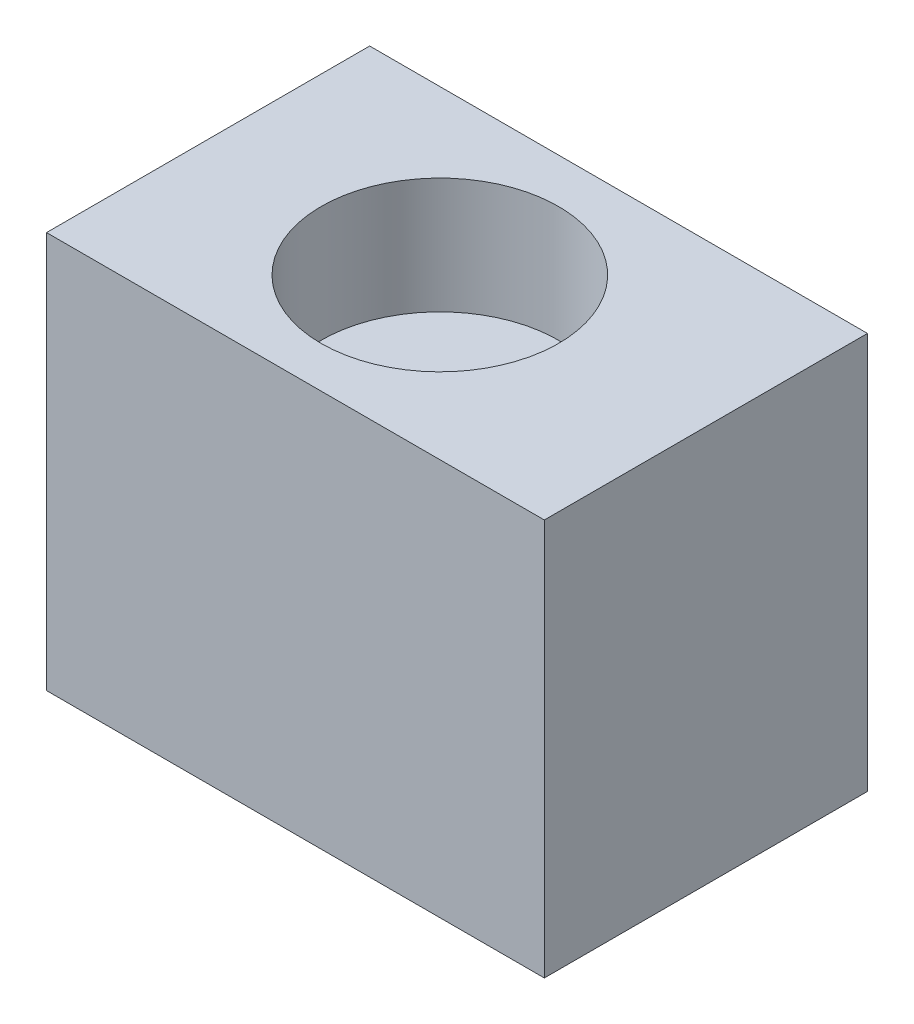
ISO-10303-21;
HEADER;
FILE_DESCRIPTION(('STEP AP214'),'2;1');
FILE_NAME('part.step','',(''),(''),'','','');
FILE_SCHEMA(('AUTOMOTIVE_DESIGN { 1 0 10303 214 1 1 1 1 }'));
ENDSEC;
DATA;
#1=APPLICATION_CONTEXT('core data for automotive mechanical design processes');
#2=APPLICATION_PROTOCOL_DEFINITION('international standard','automotive_design',2000,#1);
#3=PRODUCT_CONTEXT('',#1,'mechanical');
#4=PRODUCT('Part','Part','',(#3));
#5=PRODUCT_RELATED_PRODUCT_CATEGORY('part','',(#4));
#6=PRODUCT_DEFINITION_FORMATION('','',#4);
#7=PRODUCT_DEFINITION_CONTEXT('part definition',#1,'design');
#8=PRODUCT_DEFINITION('design','',#6,#7);
#9=PRODUCT_DEFINITION_SHAPE('','',#8);
#10=(LENGTH_UNIT() NAMED_UNIT(*) SI_UNIT(.MILLI.,.METRE.));
#11=(NAMED_UNIT(*) PLANE_ANGLE_UNIT() SI_UNIT($,.RADIAN.));
#12=(NAMED_UNIT(*) SI_UNIT($,.STERADIAN.) SOLID_ANGLE_UNIT());
#13=UNCERTAINTY_MEASURE_WITH_UNIT(LENGTH_MEASURE(1.E-05),#10,'distance_accuracy_value','');
#14=(GEOMETRIC_REPRESENTATION_CONTEXT(3) GLOBAL_UNCERTAINTY_ASSIGNED_CONTEXT((#13)) GLOBAL_UNIT_ASSIGNED_CONTEXT((#10,
#11,#12)) REPRESENTATION_CONTEXT('',''));
#15=CARTESIAN_POINT('',(0.,0.,0.));
#16=DIRECTION('',(0.,0.,1.));
#17=DIRECTION('',(1.,0.,0.));
#18=AXIS2_PLACEMENT_3D('',#15,#16,#17);
#19=CARTESIAN_POINT('',(0.,0.,29.84));
#20=DIRECTION('',(1.,0.,0.));
#21=DIRECTION('',(0.,0.,-1.));
#22=AXIS2_PLACEMENT_3D('',#19,#20,#21);
#23=PLANE('',#22);
#24=DIRECTION('',(0.,-1.,0.));
#25=VECTOR('',#24,1.);
#26=CARTESIAN_POINT('',(0.,0.,0.));
#27=LINE('',#26,#25);
#28=CARTESIAN_POINT('',(0.,36.63,0.));
#29=VERTEX_POINT('',#28);
#30=CARTESIAN_POINT('',(0.,0.,0.));
#31=VERTEX_POINT('',#30);
#32=EDGE_CURVE('E107',#29,#31,#27,.T.);
#33=ORIENTED_EDGE('',*,*,#32,.T.);
#34=DIRECTION('',(0.,0.,-1.));
#35=VECTOR('',#34,1.);
#36=CARTESIAN_POINT('',(0.,0.,29.84));
#37=LINE('',#36,#35);
#38=CARTESIAN_POINT('',(0.,0.,29.84));
#39=VERTEX_POINT('',#38);
#40=EDGE_CURVE('E11',#39,#31,#37,.T.);
#41=ORIENTED_EDGE('',*,*,#40,.F.);
#42=DIRECTION('',(0.,-1.,0.));
#43=VECTOR('',#42,1.);
#44=CARTESIAN_POINT('',(0.,0.,29.84));
#45=LINE('',#44,#43);
#46=CARTESIAN_POINT('',(0.,36.63,29.84));
#47=VERTEX_POINT('',#46);
#48=EDGE_CURVE('E91',#47,#39,#45,.T.);
#49=ORIENTED_EDGE('',*,*,#48,.F.);
#50=DIRECTION('',(0.,0.,-1.));
#51=VECTOR('',#50,1.);
#52=CARTESIAN_POINT('',(0.,36.63,29.84));
#53=LINE('',#52,#51);
#54=EDGE_CURVE('E103',#47,#29,#53,.T.);
#55=ORIENTED_EDGE('',*,*,#54,.T.);
#56=EDGE_LOOP('',(#33,#41,#49,#55));
#57=FACE_BOUND('',#56,.T.);
#58=ADVANCED_FACE('F39',(#57),#23,.F.);
#59=CARTESIAN_POINT('',(0.,0.,29.84));
#60=DIRECTION('',(0.,1.,0.));
#61=DIRECTION('',(0.,0.,1.));
#62=AXIS2_PLACEMENT_3D('',#59,#60,#61);
#63=PLANE('',#62);
#64=DIRECTION('',(1.,0.,0.));
#65=VECTOR('',#64,1.);
#66=CARTESIAN_POINT('',(0.,0.,0.));
#67=LINE('',#66,#65);
#68=CARTESIAN_POINT('',(45.97,0.,0.));
#69=VERTEX_POINT('',#68);
#70=EDGE_CURVE('E96',#31,#69,#67,.T.);
#71=ORIENTED_EDGE('',*,*,#70,.T.);
#72=DIRECTION('',(0.,0.,-1.));
#73=VECTOR('',#72,1.);
#74=CARTESIAN_POINT('',(45.97,0.,29.84));
#75=LINE('',#74,#73);
#76=CARTESIAN_POINT('',(45.97,0.,29.84));
#77=VERTEX_POINT('',#76);
#78=EDGE_CURVE('E48',#77,#69,#75,.T.);
#79=ORIENTED_EDGE('',*,*,#78,.F.);
#80=DIRECTION('',(1.,0.,0.));
#81=VECTOR('',#80,1.);
#82=CARTESIAN_POINT('',(0.,0.,29.84));
#83=LINE('',#82,#81);
#84=EDGE_CURVE('E86',#39,#77,#83,.T.);
#85=ORIENTED_EDGE('',*,*,#84,.F.);
#86=ORIENTED_EDGE('',*,*,#40,.T.);
#87=EDGE_LOOP('',(#71,#79,#85,#86));
#88=FACE_BOUND('',#87,.T.);
#89=ADVANCED_FACE('F95',(#88),#63,.F.);
#90=CARTESIAN_POINT('',(45.97,0.,29.84));
#91=DIRECTION('',(-1.,0.,0.));
#92=DIRECTION('',(0.,-1.,0.));
#93=AXIS2_PLACEMENT_3D('',#90,#91,#92);
#94=PLANE('',#93);
#95=DIRECTION('',(0.,1.,0.));
#96=VECTOR('',#95,1.);
#97=CARTESIAN_POINT('',(45.97,0.,0.));
#98=LINE('',#97,#96);
#99=CARTESIAN_POINT('',(45.97,36.63,0.));
#100=VERTEX_POINT('',#99);
#101=EDGE_CURVE('E73',#69,#100,#98,.T.);
#102=ORIENTED_EDGE('',*,*,#101,.T.);
#103=DIRECTION('',(0.,0.,-1.));
#104=VECTOR('',#103,1.);
#105=CARTESIAN_POINT('',(45.97,36.63,29.84));
#106=LINE('',#105,#104);
#107=CARTESIAN_POINT('',(45.97,36.63,29.84));
#108=VERTEX_POINT('',#107);
#109=EDGE_CURVE('E98',#108,#100,#106,.T.);
#110=ORIENTED_EDGE('',*,*,#109,.F.);
#111=DIRECTION('',(0.,1.,0.));
#112=VECTOR('',#111,1.);
#113=CARTESIAN_POINT('',(45.97,0.,29.84));
#114=LINE('',#113,#112);
#115=EDGE_CURVE('E89',#77,#108,#114,.T.);
#116=ORIENTED_EDGE('',*,*,#115,.F.);
#117=ORIENTED_EDGE('',*,*,#78,.T.);
#118=EDGE_LOOP('',(#102,#110,#116,#117));
#119=FACE_BOUND('',#118,.T.);
#120=ADVANCED_FACE('F99',(#119),#94,.F.);
#121=CARTESIAN_POINT('',(0.,36.63,29.84));
#122=DIRECTION('',(0.,-1.,0.));
#123=DIRECTION('',(0.,0.,-1.));
#124=AXIS2_PLACEMENT_3D('',#121,#122,#123);
#125=PLANE('',#124);
#126=CARTESIAN_POINT('',(21.55,36.63,15.07));
#127=DIRECTION('',(0.,1.,0.));
#128=DIRECTION('',(0.,0.,1.));
#129=AXIS2_PLACEMENT_3D('',#126,#127,#128);
#130=CIRCLE('',#129,10.96);
#131=CARTESIAN_POINT('',(21.55,36.63,26.03));
#132=VERTEX_POINT('',#131);
#133=EDGE_CURVE('E128',#132,#132,#130,.T.);
#134=ORIENTED_EDGE('',*,*,#133,.F.);
#135=EDGE_LOOP('',(#134));
#136=FACE_BOUND('',#135,.T.);
#137=DIRECTION('',(-1.,0.,0.));
#138=VECTOR('',#137,1.);
#139=CARTESIAN_POINT('',(0.,36.63,0.));
#140=LINE('',#139,#138);
#141=EDGE_CURVE('E79',#100,#29,#140,.T.);
#142=ORIENTED_EDGE('',*,*,#141,.T.);
#143=ORIENTED_EDGE('',*,*,#54,.F.);
#144=DIRECTION('',(-1.,0.,0.));
#145=VECTOR('',#144,1.);
#146=CARTESIAN_POINT('',(0.,36.63,29.84));
#147=LINE('',#146,#145);
#148=EDGE_CURVE('E56',#108,#47,#147,.T.);
#149=ORIENTED_EDGE('',*,*,#148,.F.);
#150=ORIENTED_EDGE('',*,*,#109,.T.);
#151=EDGE_LOOP('',(#142,#143,#149,#150));
#152=FACE_BOUND('',#151,.T.);
#153=ADVANCED_FACE('F121',(#136,#152),#125,.F.);
#154=CARTESIAN_POINT('',(0.,0.,29.84));
#155=DIRECTION('',(0.,0.,-1.));
#156=DIRECTION('',(-1.,0.,0.));
#157=AXIS2_PLACEMENT_3D('',#154,#155,#156);
#158=PLANE('',#157);
#159=ORIENTED_EDGE('',*,*,#48,.T.);
#160=ORIENTED_EDGE('',*,*,#84,.T.);
#161=ORIENTED_EDGE('',*,*,#115,.T.);
#162=ORIENTED_EDGE('',*,*,#148,.T.);
#163=EDGE_LOOP('',(#159,#160,#161,#162));
#164=FACE_BOUND('',#163,.T.);
#165=ADVANCED_FACE('F87',(#164),#158,.F.);
#166=CARTESIAN_POINT('',(0.,0.,0.));
#167=DIRECTION('',(0.,0.,-1.));
#168=DIRECTION('',(-1.,0.,0.));
#169=AXIS2_PLACEMENT_3D('',#166,#167,#168);
#170=PLANE('',#169);
#171=ORIENTED_EDGE('',*,*,#32,.F.);
#172=ORIENTED_EDGE('',*,*,#141,.F.);
#173=ORIENTED_EDGE('',*,*,#101,.F.);
#174=ORIENTED_EDGE('',*,*,#70,.F.);
#175=EDGE_LOOP('',(#171,#172,#173,#174));
#176=FACE_BOUND('',#175,.T.);
#177=ADVANCED_FACE('F124',(#176),#170,.T.);
#178=CARTESIAN_POINT('',(21.55,25.93,15.07));
#179=DIRECTION('',(0.,1.,0.));
#180=DIRECTION('',(0.,0.,1.));
#181=AXIS2_PLACEMENT_3D('',#178,#179,#180);
#182=CYLINDRICAL_SURFACE('',#181,10.96);
#183=CARTESIAN_POINT('',(21.55,25.93,15.07));
#184=DIRECTION('',(0.,1.,0.));
#185=DIRECTION('',(0.,0.,1.));
#186=AXIS2_PLACEMENT_3D('',#183,#184,#185);
#187=CIRCLE('',#186,10.96);
#188=CARTESIAN_POINT('',(21.55,25.93,26.03));
#189=VERTEX_POINT('',#188);
#190=EDGE_CURVE('E111',#189,#189,#187,.T.);
#191=ORIENTED_EDGE('',*,*,#190,.F.);
#192=EDGE_LOOP('',(#191));
#193=FACE_BOUND('',#192,.T.);
#194=ORIENTED_EDGE('',*,*,#133,.T.);
#195=EDGE_LOOP('',(#194));
#196=FACE_BOUND('',#195,.T.);
#197=ADVANCED_FACE('F138',(#193,#196),#182,.F.);
#198=CARTESIAN_POINT('',(21.55,25.93,15.07));
#199=DIRECTION('',(0.,1.,0.));
#200=DIRECTION('',(0.,0.,1.));
#201=AXIS2_PLACEMENT_3D('',#198,#199,#200);
#202=PLANE('',#201);
#203=ORIENTED_EDGE('',*,*,#190,.T.);
#204=EDGE_LOOP('',(#203));
#205=FACE_BOUND('',#204,.T.);
#206=ADVANCED_FACE('F136',(#205),#202,.T.);
#207=CLOSED_SHELL('',(#58,#89,#120,#153,#165,#177,#197,#206));
#208=MANIFOLD_SOLID_BREP('B2',#207);
#209=ADVANCED_BREP_SHAPE_REPRESENTATION('',(#18,#208),#14);
#210=SHAPE_DEFINITION_REPRESENTATION(#9,#209);
ENDSEC;
END-ISO-10303-21;
